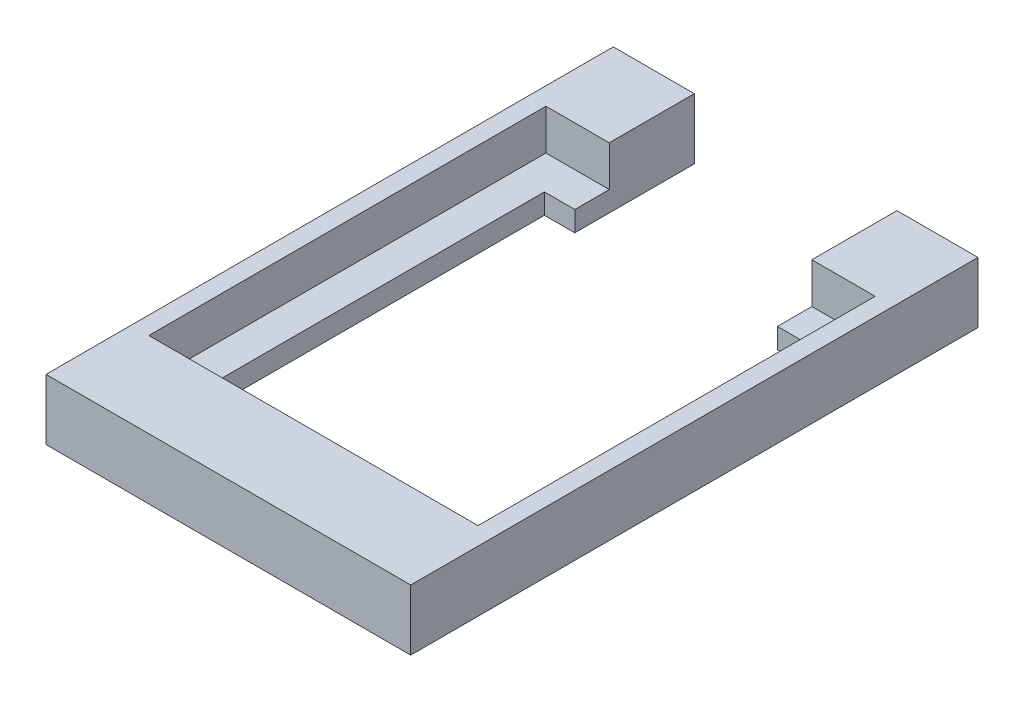
ISO-10303-21;
HEADER;
FILE_DESCRIPTION(('STEP AP214'),'2;1');
FILE_NAME('part.step','',(''),(''),'','','');
FILE_SCHEMA(('AUTOMOTIVE_DESIGN { 1 0 10303 214 1 1 1 1 }'));
ENDSEC;
DATA;
#1=APPLICATION_CONTEXT('core data for automotive mechanical design processes');
#2=APPLICATION_PROTOCOL_DEFINITION('international standard','automotive_design',2000,#1);
#3=PRODUCT_CONTEXT('',#1,'mechanical');
#4=PRODUCT('Part','Part','',(#3));
#5=PRODUCT_RELATED_PRODUCT_CATEGORY('part','',(#4));
#6=PRODUCT_DEFINITION_FORMATION('','',#4);
#7=PRODUCT_DEFINITION_CONTEXT('part definition',#1,'design');
#8=PRODUCT_DEFINITION('design','',#6,#7);
#9=PRODUCT_DEFINITION_SHAPE('','',#8);
#10=(LENGTH_UNIT() NAMED_UNIT(*) SI_UNIT(.MILLI.,.METRE.));
#11=(NAMED_UNIT(*) PLANE_ANGLE_UNIT() SI_UNIT($,.RADIAN.));
#12=(NAMED_UNIT(*) SI_UNIT($,.STERADIAN.) SOLID_ANGLE_UNIT());
#13=UNCERTAINTY_MEASURE_WITH_UNIT(LENGTH_MEASURE(1.E-05),#10,'distance_accuracy_value','');
#14=(GEOMETRIC_REPRESENTATION_CONTEXT(3) GLOBAL_UNCERTAINTY_ASSIGNED_CONTEXT((#13)) GLOBAL_UNIT_ASSIGNED_CONTEXT((#10,
#11,#12)) REPRESENTATION_CONTEXT('',''));
#15=CARTESIAN_POINT('',(0.,0.,0.));
#16=DIRECTION('',(0.,0.,1.));
#17=DIRECTION('',(1.,0.,0.));
#18=AXIS2_PLACEMENT_3D('',#15,#16,#17);
#19=CARTESIAN_POINT('',(0.,3.,-8.1));
#20=DIRECTION('',(0.,0.,-1.));
#21=DIRECTION('',(-1.,0.,0.));
#22=AXIS2_PLACEMENT_3D('',#19,#20,#21);
#23=PLANE('',#22);
#24=DIRECTION('',(1.,0.,0.));
#25=VECTOR('',#24,1.);
#26=CARTESIAN_POINT('',(0.,0.,-8.1));
#27=LINE('',#26,#25);
#28=CARTESIAN_POINT('',(-6.5,0.,-8.1));
#29=VERTEX_POINT('',#28);
#30=CARTESIAN_POINT('',(-5.,0.,-8.1));
#31=VERTEX_POINT('',#30);
#32=EDGE_CURVE('E224',#29,#31,#27,.T.);
#33=ORIENTED_EDGE('',*,*,#32,.T.);
#34=DIRECTION('',(0.,1.,0.));
#35=VECTOR('',#34,1.);
#36=CARTESIAN_POINT('',(-5.,3.,-8.1));
#37=LINE('',#36,#35);
#38=CARTESIAN_POINT('',(-5.,1.,-8.1));
#39=VERTEX_POINT('',#38);
#40=EDGE_CURVE('E283',#31,#39,#37,.T.);
#41=ORIENTED_EDGE('',*,*,#40,.T.);
#42=DIRECTION('',(1.,0.,0.));
#43=VECTOR('',#42,1.);
#44=CARTESIAN_POINT('',(0.,1.,-8.1));
#45=LINE('',#44,#43);
#46=CARTESIAN_POINT('',(-6.5,1.,-8.1));
#47=VERTEX_POINT('',#46);
#48=EDGE_CURVE('E208',#47,#39,#45,.T.);
#49=ORIENTED_EDGE('',*,*,#48,.F.);
#50=DIRECTION('',(0.,-1.,0.));
#51=VECTOR('',#50,1.);
#52=CARTESIAN_POINT('',(-6.5,3.,-8.1));
#53=LINE('',#52,#51);
#54=EDGE_CURVE('E232',#47,#29,#53,.T.);
#55=ORIENTED_EDGE('',*,*,#54,.T.);
#56=EDGE_LOOP('',(#33,#41,#49,#55));
#57=FACE_BOUND('',#56,.T.);
#58=ADVANCED_FACE('F39',(#57),#23,.F.);
#59=CARTESIAN_POINT('',(0.,3.,-14.));
#60=DIRECTION('',(0.,0.,-1.));
#61=DIRECTION('',(-1.,0.,0.));
#62=AXIS2_PLACEMENT_3D('',#59,#60,#61);
#63=PLANE('',#62);
#64=DIRECTION('',(0.,1.,0.));
#65=VECTOR('',#64,1.);
#66=CARTESIAN_POINT('',(-5.,3.,-14.));
#67=LINE('',#66,#65);
#68=CARTESIAN_POINT('',(-5.,0.,-14.));
#69=VERTEX_POINT('',#68);
#70=CARTESIAN_POINT('',(-5.,3.,-14.));
#71=VERTEX_POINT('',#70);
#72=EDGE_CURVE('E303',#69,#71,#67,.T.);
#73=ORIENTED_EDGE('',*,*,#72,.F.);
#74=DIRECTION('',(1.,0.,0.));
#75=VECTOR('',#74,1.);
#76=CARTESIAN_POINT('',(0.,0.,-14.));
#77=LINE('',#76,#75);
#78=CARTESIAN_POINT('',(-9.,0.,-14.));
#79=VERTEX_POINT('',#78);
#80=EDGE_CURVE('E259',#79,#69,#77,.T.);
#81=ORIENTED_EDGE('',*,*,#80,.F.);
#82=DIRECTION('',(0.,-1.,0.));
#83=VECTOR('',#82,1.);
#84=CARTESIAN_POINT('',(-9.,3.,-14.));
#85=LINE('',#84,#83);
#86=CARTESIAN_POINT('',(-9.,3.,-14.));
#87=VERTEX_POINT('',#86);
#88=EDGE_CURVE('E265',#87,#79,#85,.T.);
#89=ORIENTED_EDGE('',*,*,#88,.F.);
#90=DIRECTION('',(1.,0.,0.));
#91=VECTOR('',#90,1.);
#92=CARTESIAN_POINT('',(0.,3.,-14.));
#93=LINE('',#92,#91);
#94=EDGE_CURVE('E246',#87,#71,#93,.T.);
#95=ORIENTED_EDGE('',*,*,#94,.T.);
#96=EDGE_LOOP('',(#73,#81,#89,#95));
#97=FACE_BOUND('',#96,.T.);
#98=ADVANCED_FACE('F333',(#97),#63,.T.);
#99=CARTESIAN_POINT('',(8.125,1.,-9.8));
#100=DIRECTION('',(0.,0.,-1.));
#101=DIRECTION('',(-1.,0.,0.));
#102=AXIS2_PLACEMENT_3D('',#99,#100,#101);
#103=PLANE('',#102);
#104=DIRECTION('',(-1.,0.,0.));
#105=VECTOR('',#104,1.);
#106=CARTESIAN_POINT('',(8.125,1.,-9.8));
#107=LINE('',#106,#105);
#108=CARTESIAN_POINT('',(-5.,1.,-9.8));
#109=VERTEX_POINT('',#108);
#110=CARTESIAN_POINT('',(-8.125,1.,-9.8));
#111=VERTEX_POINT('',#110);
#112=EDGE_CURVE('E311',#109,#111,#107,.T.);
#113=ORIENTED_EDGE('',*,*,#112,.F.);
#114=DIRECTION('',(0.,1.,0.));
#115=VECTOR('',#114,1.);
#116=CARTESIAN_POINT('',(-5.,1.,-9.8));
#117=LINE('',#116,#115);
#118=CARTESIAN_POINT('',(-5.,3.,-9.8));
#119=VERTEX_POINT('',#118);
#120=EDGE_CURVE('E53',#109,#119,#117,.T.);
#121=ORIENTED_EDGE('',*,*,#120,.T.);
#122=DIRECTION('',(-1.,0.,0.));
#123=VECTOR('',#122,1.);
#124=CARTESIAN_POINT('',(8.125,3.,-9.8));
#125=LINE('',#124,#123);
#126=CARTESIAN_POINT('',(-8.125,3.,-9.8));
#127=VERTEX_POINT('',#126);
#128=EDGE_CURVE('E188',#119,#127,#125,.T.);
#129=ORIENTED_EDGE('',*,*,#128,.T.);
#130=DIRECTION('',(0.,1.,0.));
#131=VECTOR('',#130,1.);
#132=CARTESIAN_POINT('',(-8.125,1.,-9.8));
#133=LINE('',#132,#131);
#134=EDGE_CURVE('E197',#111,#127,#133,.T.);
#135=ORIENTED_EDGE('',*,*,#134,.F.);
#136=EDGE_LOOP('',(#113,#121,#129,#135));
#137=FACE_BOUND('',#136,.T.);
#138=ADVANCED_FACE('F330',(#137),#103,.F.);
#139=CARTESIAN_POINT('',(0.,3.,8.1));
#140=DIRECTION('',(0.,0.,-1.));
#141=DIRECTION('',(-1.,0.,0.));
#142=AXIS2_PLACEMENT_3D('',#139,#140,#141);
#143=PLANE('',#142);
#144=DIRECTION('',(0.,-1.,0.));
#145=VECTOR('',#144,1.);
#146=CARTESIAN_POINT('',(-6.5,3.,8.1));
#147=LINE('',#146,#145);
#148=CARTESIAN_POINT('',(-6.5,1.,8.1));
#149=VERTEX_POINT('',#148);
#150=CARTESIAN_POINT('',(-6.5,0.,8.1));
#151=VERTEX_POINT('',#150);
#152=EDGE_CURVE('E230',#149,#151,#147,.T.);
#153=ORIENTED_EDGE('',*,*,#152,.F.);
#154=DIRECTION('',(1.,0.,0.));
#155=VECTOR('',#154,1.);
#156=CARTESIAN_POINT('',(0.,1.,8.1));
#157=LINE('',#156,#155);
#158=CARTESIAN_POINT('',(6.5,1.,8.1));
#159=VERTEX_POINT('',#158);
#160=EDGE_CURVE('E214',#149,#159,#157,.T.);
#161=ORIENTED_EDGE('',*,*,#160,.T.);
#162=DIRECTION('',(0.,-1.,0.));
#163=VECTOR('',#162,1.);
#164=CARTESIAN_POINT('',(6.5,3.,8.1));
#165=LINE('',#164,#163);
#166=CARTESIAN_POINT('',(6.5,0.,8.1));
#167=VERTEX_POINT('',#166);
#168=EDGE_CURVE('E237',#159,#167,#165,.T.);
#169=ORIENTED_EDGE('',*,*,#168,.T.);
#170=DIRECTION('',(1.,0.,0.));
#171=VECTOR('',#170,1.);
#172=CARTESIAN_POINT('',(0.,0.,8.1));
#173=LINE('',#172,#171);
#174=EDGE_CURVE('E217',#151,#167,#173,.T.);
#175=ORIENTED_EDGE('',*,*,#174,.F.);
#176=EDGE_LOOP('',(#153,#161,#169,#175));
#177=FACE_BOUND('',#176,.T.);
#178=ADVANCED_FACE('F332',(#177),#143,.T.);
#179=CARTESIAN_POINT('',(6.5,3.,0.));
#180=DIRECTION('',(-1.,0.,0.));
#181=DIRECTION('',(0.,0.,1.));
#182=AXIS2_PLACEMENT_3D('',#179,#180,#181);
#183=PLANE('',#182);
#184=ORIENTED_EDGE('',*,*,#168,.F.);
#185=DIRECTION('',(0.,0.,-1.));
#186=VECTOR('',#185,1.);
#187=CARTESIAN_POINT('',(6.5,1.,0.));
#188=LINE('',#187,#186);
#189=CARTESIAN_POINT('',(6.5,1.,-8.1));
#190=VERTEX_POINT('',#189);
#191=EDGE_CURVE('E211',#159,#190,#188,.T.);
#192=ORIENTED_EDGE('',*,*,#191,.T.);
#193=DIRECTION('',(0.,-1.,0.));
#194=VECTOR('',#193,1.);
#195=CARTESIAN_POINT('',(6.5,3.,-8.1));
#196=LINE('',#195,#194);
#197=CARTESIAN_POINT('',(6.5,0.,-8.1));
#198=VERTEX_POINT('',#197);
#199=EDGE_CURVE('E234',#190,#198,#196,.T.);
#200=ORIENTED_EDGE('',*,*,#199,.T.);
#201=DIRECTION('',(0.,0.,-1.));
#202=VECTOR('',#201,1.);
#203=CARTESIAN_POINT('',(6.5,0.,0.));
#204=LINE('',#203,#202);
#205=EDGE_CURVE('E220',#167,#198,#204,.T.);
#206=ORIENTED_EDGE('',*,*,#205,.F.);
#207=EDGE_LOOP('',(#184,#192,#200,#206));
#208=FACE_BOUND('',#207,.T.);
#209=ADVANCED_FACE('F339',(#208),#183,.T.);
#210=CARTESIAN_POINT('',(5.,1.,-8.1));
#211=VERTEX_POINT('',#210);
#212=EDGE_CURVE('E200',#211,#190,#45,.T.);
#213=ORIENTED_EDGE('',*,*,#212,.F.);
#214=DIRECTION('',(0.,-1.,0.));
#215=VECTOR('',#214,1.);
#216=CARTESIAN_POINT('',(5.,3.,-8.1));
#217=LINE('',#216,#215);
#218=CARTESIAN_POINT('',(5.,0.,-8.1));
#219=VERTEX_POINT('',#218);
#220=EDGE_CURVE('E61',#211,#219,#217,.T.);
#221=ORIENTED_EDGE('',*,*,#220,.T.);
#222=EDGE_CURVE('E223',#219,#198,#27,.T.);
#223=ORIENTED_EDGE('',*,*,#222,.T.);
#224=ORIENTED_EDGE('',*,*,#199,.F.);
#225=EDGE_LOOP('',(#213,#221,#223,#224));
#226=FACE_BOUND('',#225,.T.);
#227=ADVANCED_FACE('F350',(#226),#23,.F.);
#228=CARTESIAN_POINT('',(-6.5,3.,0.));
#229=DIRECTION('',(-1.,0.,0.));
#230=DIRECTION('',(0.,0.,1.));
#231=AXIS2_PLACEMENT_3D('',#228,#229,#230);
#232=PLANE('',#231);
#233=DIRECTION('',(0.,0.,-1.));
#234=VECTOR('',#233,1.);
#235=CARTESIAN_POINT('',(-6.5,1.,0.));
#236=LINE('',#235,#234);
#237=EDGE_CURVE('E273',#149,#47,#236,.T.);
#238=ORIENTED_EDGE('',*,*,#237,.F.);
#239=ORIENTED_EDGE('',*,*,#152,.T.);
#240=DIRECTION('',(0.,0.,-1.));
#241=VECTOR('',#240,1.);
#242=CARTESIAN_POINT('',(-6.5,0.,0.));
#243=LINE('',#242,#241);
#244=EDGE_CURVE('E227',#151,#29,#243,.T.);
#245=ORIENTED_EDGE('',*,*,#244,.T.);
#246=ORIENTED_EDGE('',*,*,#54,.F.);
#247=EDGE_LOOP('',(#238,#239,#245,#246));
#248=FACE_BOUND('',#247,.T.);
#249=ADVANCED_FACE('F284',(#248),#232,.F.);
#250=CARTESIAN_POINT('',(0.,3.,0.));
#251=DIRECTION('',(0.,1.,0.));
#252=DIRECTION('',(0.,0.,1.));
#253=AXIS2_PLACEMENT_3D('',#250,#251,#252);
#254=PLANE('',#253);
#255=DIRECTION('',(0.,0.,1.));
#256=VECTOR('',#255,1.);
#257=CARTESIAN_POINT('',(-5.,3.,-5.30000000000001));
#258=LINE('',#257,#256);
#259=EDGE_CURVE('E182',#71,#119,#258,.T.);
#260=ORIENTED_EDGE('',*,*,#259,.F.);
#261=ORIENTED_EDGE('',*,*,#94,.F.);
#262=DIRECTION('',(0.,0.,-1.));
#263=VECTOR('',#262,1.);
#264=CARTESIAN_POINT('',(-9.,3.,0.));
#265=LINE('',#264,#263);
#266=CARTESIAN_POINT('',(-9.,3.,14.));
#267=VERTEX_POINT('',#266);
#268=EDGE_CURVE('E249',#267,#87,#265,.T.);
#269=ORIENTED_EDGE('',*,*,#268,.F.);
#270=DIRECTION('',(1.,0.,0.));
#271=VECTOR('',#270,1.);
#272=CARTESIAN_POINT('',(0.,3.,14.));
#273=LINE('',#272,#271);
#274=CARTESIAN_POINT('',(9.,3.,14.));
#275=VERTEX_POINT('',#274);
#276=EDGE_CURVE('E240',#267,#275,#273,.T.);
#277=ORIENTED_EDGE('',*,*,#276,.T.);
#278=DIRECTION('',(0.,0.,-1.));
#279=VECTOR('',#278,1.);
#280=CARTESIAN_POINT('',(9.,3.,0.));
#281=LINE('',#280,#279);
#282=CARTESIAN_POINT('',(9.,3.,-14.));
#283=VERTEX_POINT('',#282);
#284=EDGE_CURVE('E243',#275,#283,#281,.T.);
#285=ORIENTED_EDGE('',*,*,#284,.T.);
#286=CARTESIAN_POINT('',(5.,3.,-14.));
#287=VERTEX_POINT('',#286);
#288=EDGE_CURVE('E180',#287,#283,#93,.T.);
#289=ORIENTED_EDGE('',*,*,#288,.F.);
#290=DIRECTION('',(0.,0.,-1.));
#291=VECTOR('',#290,1.);
#292=CARTESIAN_POINT('',(5.,3.,-5.30000000000001));
#293=LINE('',#292,#291);
#294=CARTESIAN_POINT('',(5.,3.,-9.8));
#295=VERTEX_POINT('',#294);
#296=EDGE_CURVE('E164',#295,#287,#293,.T.);
#297=ORIENTED_EDGE('',*,*,#296,.F.);
#298=CARTESIAN_POINT('',(8.125,3.,-9.8));
#299=VERTEX_POINT('',#298);
#300=EDGE_CURVE('E178',#299,#295,#125,.T.);
#301=ORIENTED_EDGE('',*,*,#300,.F.);
#302=DIRECTION('',(0.,0.,-1.));
#303=VECTOR('',#302,1.);
#304=CARTESIAN_POINT('',(8.125,3.,9.8));
#305=LINE('',#304,#303);
#306=CARTESIAN_POINT('',(8.125,3.,9.8));
#307=VERTEX_POINT('',#306);
#308=EDGE_CURVE('E193',#307,#299,#305,.T.);
#309=ORIENTED_EDGE('',*,*,#308,.F.);
#310=DIRECTION('',(1.,0.,0.));
#311=VECTOR('',#310,1.);
#312=CARTESIAN_POINT('',(8.125,3.,9.8));
#313=LINE('',#312,#311);
#314=CARTESIAN_POINT('',(-8.125,3.,9.8));
#315=VERTEX_POINT('',#314);
#316=EDGE_CURVE('E313',#315,#307,#313,.T.);
#317=ORIENTED_EDGE('',*,*,#316,.F.);
#318=DIRECTION('',(0.,0.,1.));
#319=VECTOR('',#318,1.);
#320=CARTESIAN_POINT('',(-8.125,3.,9.8));
#321=LINE('',#320,#319);
#322=EDGE_CURVE('E304',#127,#315,#321,.T.);
#323=ORIENTED_EDGE('',*,*,#322,.F.);
#324=ORIENTED_EDGE('',*,*,#128,.F.);
#325=EDGE_LOOP('',(#260,#261,#269,#277,#285,#289,#297,#301,#309,#317,#323,#324));
#326=FACE_BOUND('',#325,.T.);
#327=ADVANCED_FACE('F176',(#326),#254,.T.);
#328=CARTESIAN_POINT('',(0.,0.,0.));
#329=DIRECTION('',(0.,1.,0.));
#330=DIRECTION('',(0.,0.,1.));
#331=AXIS2_PLACEMENT_3D('',#328,#329,#330);
#332=PLANE('',#331);
#333=ORIENTED_EDGE('',*,*,#80,.T.);
#334=DIRECTION('',(0.,0.,1.));
#335=VECTOR('',#334,1.);
#336=CARTESIAN_POINT('',(-5.,0.,-5.30000000000001));
#337=LINE('',#336,#335);
#338=EDGE_CURVE('E181',#69,#31,#337,.T.);
#339=ORIENTED_EDGE('',*,*,#338,.T.);
#340=ORIENTED_EDGE('',*,*,#32,.F.);
#341=ORIENTED_EDGE('',*,*,#244,.F.);
#342=ORIENTED_EDGE('',*,*,#174,.T.);
#343=ORIENTED_EDGE('',*,*,#205,.T.);
#344=ORIENTED_EDGE('',*,*,#222,.F.);
#345=DIRECTION('',(0.,0.,-1.));
#346=VECTOR('',#345,1.);
#347=CARTESIAN_POINT('',(5.,0.,-5.30000000000001));
#348=LINE('',#347,#346);
#349=CARTESIAN_POINT('',(5.,0.,-14.));
#350=VERTEX_POINT('',#349);
#351=EDGE_CURVE('E170',#219,#350,#348,.T.);
#352=ORIENTED_EDGE('',*,*,#351,.T.);
#353=CARTESIAN_POINT('',(9.,0.,-14.));
#354=VERTEX_POINT('',#353);
#355=EDGE_CURVE('E258',#350,#354,#77,.T.);
#356=ORIENTED_EDGE('',*,*,#355,.T.);
#357=DIRECTION('',(0.,0.,-1.));
#358=VECTOR('',#357,1.);
#359=CARTESIAN_POINT('',(9.,0.,0.));
#360=LINE('',#359,#358);
#361=CARTESIAN_POINT('',(9.,0.,14.));
#362=VERTEX_POINT('',#361);
#363=EDGE_CURVE('E255',#362,#354,#360,.T.);
#364=ORIENTED_EDGE('',*,*,#363,.F.);
#365=DIRECTION('',(1.,0.,0.));
#366=VECTOR('',#365,1.);
#367=CARTESIAN_POINT('',(0.,0.,14.));
#368=LINE('',#367,#366);
#369=CARTESIAN_POINT('',(-9.,0.,14.));
#370=VERTEX_POINT('',#369);
#371=EDGE_CURVE('E239',#370,#362,#368,.T.);
#372=ORIENTED_EDGE('',*,*,#371,.F.);
#373=DIRECTION('',(0.,0.,-1.));
#374=VECTOR('',#373,1.);
#375=CARTESIAN_POINT('',(-9.,0.,0.));
#376=LINE('',#375,#374);
#377=EDGE_CURVE('E244',#370,#79,#376,.T.);
#378=ORIENTED_EDGE('',*,*,#377,.T.);
#379=EDGE_LOOP('',(#333,#339,#340,#341,#342,#343,#344,#352,#356,#364,#372,#378));
#380=FACE_BOUND('',#379,.T.);
#381=ADVANCED_FACE('F290',(#380),#332,.F.);
#382=CARTESIAN_POINT('',(0.,3.,14.));
#383=DIRECTION('',(0.,0.,-1.));
#384=DIRECTION('',(-1.,0.,0.));
#385=AXIS2_PLACEMENT_3D('',#382,#383,#384);
#386=PLANE('',#385);
#387=ORIENTED_EDGE('',*,*,#371,.T.);
#388=DIRECTION('',(0.,-1.,0.));
#389=VECTOR('',#388,1.);
#390=CARTESIAN_POINT('',(9.,3.,14.));
#391=LINE('',#390,#389);
#392=EDGE_CURVE('E270',#275,#362,#391,.T.);
#393=ORIENTED_EDGE('',*,*,#392,.F.);
#394=ORIENTED_EDGE('',*,*,#276,.F.);
#395=DIRECTION('',(0.,-1.,0.));
#396=VECTOR('',#395,1.);
#397=CARTESIAN_POINT('',(-9.,3.,14.));
#398=LINE('',#397,#396);
#399=EDGE_CURVE('E252',#267,#370,#398,.T.);
#400=ORIENTED_EDGE('',*,*,#399,.T.);
#401=EDGE_LOOP('',(#387,#393,#394,#400));
#402=FACE_BOUND('',#401,.T.);
#403=ADVANCED_FACE('F41',(#402),#386,.F.);
#404=CARTESIAN_POINT('',(9.,3.,0.));
#405=DIRECTION('',(-1.,0.,0.));
#406=DIRECTION('',(0.,0.,1.));
#407=AXIS2_PLACEMENT_3D('',#404,#405,#406);
#408=PLANE('',#407);
#409=ORIENTED_EDGE('',*,*,#363,.T.);
#410=DIRECTION('',(0.,-1.,0.));
#411=VECTOR('',#410,1.);
#412=CARTESIAN_POINT('',(9.,3.,-14.));
#413=LINE('',#412,#411);
#414=EDGE_CURVE('E267',#283,#354,#413,.T.);
#415=ORIENTED_EDGE('',*,*,#414,.F.);
#416=ORIENTED_EDGE('',*,*,#284,.F.);
#417=ORIENTED_EDGE('',*,*,#392,.T.);
#418=EDGE_LOOP('',(#409,#415,#416,#417));
#419=FACE_BOUND('',#418,.T.);
#420=ADVANCED_FACE('F371',(#419),#408,.F.);
#421=DIRECTION('',(0.,-1.,0.));
#422=VECTOR('',#421,1.);
#423=CARTESIAN_POINT('',(5.,3.,-14.));
#424=LINE('',#423,#422);
#425=EDGE_CURVE('E299',#287,#350,#424,.T.);
#426=ORIENTED_EDGE('',*,*,#425,.F.);
#427=ORIENTED_EDGE('',*,*,#288,.T.);
#428=ORIENTED_EDGE('',*,*,#414,.T.);
#429=ORIENTED_EDGE('',*,*,#355,.F.);
#430=EDGE_LOOP('',(#426,#427,#428,#429));
#431=FACE_BOUND('',#430,.T.);
#432=ADVANCED_FACE('F344',(#431),#63,.T.);
#433=CARTESIAN_POINT('',(-9.,3.,0.));
#434=DIRECTION('',(-1.,0.,0.));
#435=DIRECTION('',(0.,0.,1.));
#436=AXIS2_PLACEMENT_3D('',#433,#434,#435);
#437=PLANE('',#436);
#438=ORIENTED_EDGE('',*,*,#377,.F.);
#439=ORIENTED_EDGE('',*,*,#399,.F.);
#440=ORIENTED_EDGE('',*,*,#268,.T.);
#441=ORIENTED_EDGE('',*,*,#88,.T.);
#442=EDGE_LOOP('',(#438,#439,#440,#441));
#443=FACE_BOUND('',#442,.T.);
#444=ADVANCED_FACE('F377',(#443),#437,.T.);
#445=CARTESIAN_POINT('',(-8.125,1.,9.8));
#446=DIRECTION('',(-1.,0.,0.));
#447=DIRECTION('',(0.,0.,1.));
#448=AXIS2_PLACEMENT_3D('',#445,#446,#447);
#449=PLANE('',#448);
#450=ORIENTED_EDGE('',*,*,#322,.T.);
#451=DIRECTION('',(0.,1.,0.));
#452=VECTOR('',#451,1.);
#453=CARTESIAN_POINT('',(-8.125,1.,9.8));
#454=LINE('',#453,#452);
#455=CARTESIAN_POINT('',(-8.125,1.,9.8));
#456=VERTEX_POINT('',#455);
#457=EDGE_CURVE('E204',#456,#315,#454,.T.);
#458=ORIENTED_EDGE('',*,*,#457,.F.);
#459=DIRECTION('',(0.,0.,1.));
#460=VECTOR('',#459,1.);
#461=CARTESIAN_POINT('',(-8.125,1.,9.8));
#462=LINE('',#461,#460);
#463=EDGE_CURVE('E187',#111,#456,#462,.T.);
#464=ORIENTED_EDGE('',*,*,#463,.F.);
#465=ORIENTED_EDGE('',*,*,#134,.T.);
#466=EDGE_LOOP('',(#450,#458,#464,#465));
#467=FACE_BOUND('',#466,.T.);
#468=ADVANCED_FACE('F323',(#467),#449,.F.);
#469=ORIENTED_EDGE('',*,*,#300,.T.);
#470=DIRECTION('',(0.,-1.,0.));
#471=VECTOR('',#470,1.);
#472=CARTESIAN_POINT('',(5.,1.,-9.8));
#473=LINE('',#472,#471);
#474=CARTESIAN_POINT('',(5.,1.,-9.8));
#475=VERTEX_POINT('',#474);
#476=EDGE_CURVE('E161',#295,#475,#473,.T.);
#477=ORIENTED_EDGE('',*,*,#476,.T.);
#478=CARTESIAN_POINT('',(8.125,1.,-9.8));
#479=VERTEX_POINT('',#478);
#480=EDGE_CURVE('E207',#479,#475,#107,.T.);
#481=ORIENTED_EDGE('',*,*,#480,.F.);
#482=DIRECTION('',(0.,1.,0.));
#483=VECTOR('',#482,1.);
#484=CARTESIAN_POINT('',(8.125,1.,-9.8));
#485=LINE('',#484,#483);
#486=EDGE_CURVE('E185',#479,#299,#485,.T.);
#487=ORIENTED_EDGE('',*,*,#486,.T.);
#488=EDGE_LOOP('',(#469,#477,#481,#487));
#489=FACE_BOUND('',#488,.T.);
#490=ADVANCED_FACE('F184',(#489),#103,.F.);
#491=CARTESIAN_POINT('',(8.125,1.,9.8));
#492=DIRECTION('',(1.,0.,0.));
#493=DIRECTION('',(0.,0.,-1.));
#494=AXIS2_PLACEMENT_3D('',#491,#492,#493);
#495=PLANE('',#494);
#496=ORIENTED_EDGE('',*,*,#308,.T.);
#497=ORIENTED_EDGE('',*,*,#486,.F.);
#498=DIRECTION('',(0.,0.,-1.));
#499=VECTOR('',#498,1.);
#500=CARTESIAN_POINT('',(8.125,1.,9.8));
#501=LINE('',#500,#499);
#502=CARTESIAN_POINT('',(8.125,1.,9.8));
#503=VERTEX_POINT('',#502);
#504=EDGE_CURVE('E308',#503,#479,#501,.T.);
#505=ORIENTED_EDGE('',*,*,#504,.F.);
#506=DIRECTION('',(0.,1.,0.));
#507=VECTOR('',#506,1.);
#508=CARTESIAN_POINT('',(8.125,1.,9.8));
#509=LINE('',#508,#507);
#510=EDGE_CURVE('E202',#503,#307,#509,.T.);
#511=ORIENTED_EDGE('',*,*,#510,.T.);
#512=EDGE_LOOP('',(#496,#497,#505,#511));
#513=FACE_BOUND('',#512,.T.);
#514=ADVANCED_FACE('F318',(#513),#495,.F.);
#515=CARTESIAN_POINT('',(8.125,1.,9.8));
#516=DIRECTION('',(0.,0.,1.));
#517=DIRECTION('',(1.,0.,0.));
#518=AXIS2_PLACEMENT_3D('',#515,#516,#517);
#519=PLANE('',#518);
#520=ORIENTED_EDGE('',*,*,#316,.T.);
#521=ORIENTED_EDGE('',*,*,#510,.F.);
#522=DIRECTION('',(1.,0.,0.));
#523=VECTOR('',#522,1.);
#524=CARTESIAN_POINT('',(8.125,1.,9.8));
#525=LINE('',#524,#523);
#526=EDGE_CURVE('E191',#456,#503,#525,.T.);
#527=ORIENTED_EDGE('',*,*,#526,.F.);
#528=ORIENTED_EDGE('',*,*,#457,.T.);
#529=EDGE_LOOP('',(#520,#521,#527,#528));
#530=FACE_BOUND('',#529,.T.);
#531=ADVANCED_FACE('F327',(#530),#519,.F.);
#532=CARTESIAN_POINT('',(0.,1.,0.));
#533=DIRECTION('',(0.,1.,0.));
#534=DIRECTION('',(0.,0.,1.));
#535=AXIS2_PLACEMENT_3D('',#532,#533,#534);
#536=PLANE('',#535);
#537=DIRECTION('',(0.,0.,1.));
#538=VECTOR('',#537,1.);
#539=CARTESIAN_POINT('',(-5.,1.,0.));
#540=LINE('',#539,#538);
#541=EDGE_CURVE('E11',#109,#39,#540,.T.);
#542=ORIENTED_EDGE('',*,*,#541,.F.);
#543=ORIENTED_EDGE('',*,*,#112,.T.);
#544=ORIENTED_EDGE('',*,*,#463,.T.);
#545=ORIENTED_EDGE('',*,*,#526,.T.);
#546=ORIENTED_EDGE('',*,*,#504,.T.);
#547=ORIENTED_EDGE('',*,*,#480,.T.);
#548=DIRECTION('',(0.,0.,-1.));
#549=VECTOR('',#548,1.);
#550=CARTESIAN_POINT('',(5.,1.,0.));
#551=LINE('',#550,#549);
#552=EDGE_CURVE('E47',#211,#475,#551,.T.);
#553=ORIENTED_EDGE('',*,*,#552,.F.);
#554=ORIENTED_EDGE('',*,*,#212,.T.);
#555=ORIENTED_EDGE('',*,*,#191,.F.);
#556=ORIENTED_EDGE('',*,*,#160,.F.);
#557=ORIENTED_EDGE('',*,*,#237,.T.);
#558=ORIENTED_EDGE('',*,*,#48,.T.);
#559=EDGE_LOOP('',(#542,#543,#544,#545,#546,#547,#553,#554,#555,#556,#557,#558));
#560=FACE_BOUND('',#559,.T.);
#561=ADVANCED_FACE('F277',(#560),#536,.T.);
#562=CARTESIAN_POINT('',(5.,0.,-5.30000000000001));
#563=DIRECTION('',(1.,0.,0.));
#564=DIRECTION('',(0.,0.,-1.));
#565=AXIS2_PLACEMENT_3D('',#562,#563,#564);
#566=PLANE('',#565);
#567=ORIENTED_EDGE('',*,*,#425,.T.);
#568=ORIENTED_EDGE('',*,*,#351,.F.);
#569=ORIENTED_EDGE('',*,*,#220,.F.);
#570=ORIENTED_EDGE('',*,*,#552,.T.);
#571=ORIENTED_EDGE('',*,*,#476,.F.);
#572=ORIENTED_EDGE('',*,*,#296,.T.);
#573=EDGE_LOOP('',(#567,#568,#569,#570,#571,#572));
#574=FACE_BOUND('',#573,.T.);
#575=ADVANCED_FACE('F163',(#574),#566,.F.);
#576=CARTESIAN_POINT('',(-5.,0.,-5.30000000000001));
#577=DIRECTION('',(-1.,0.,0.));
#578=DIRECTION('',(0.,0.,1.));
#579=AXIS2_PLACEMENT_3D('',#576,#577,#578);
#580=PLANE('',#579);
#581=ORIENTED_EDGE('',*,*,#72,.T.);
#582=ORIENTED_EDGE('',*,*,#259,.T.);
#583=ORIENTED_EDGE('',*,*,#120,.F.);
#584=ORIENTED_EDGE('',*,*,#541,.T.);
#585=ORIENTED_EDGE('',*,*,#40,.F.);
#586=ORIENTED_EDGE('',*,*,#338,.F.);
#587=EDGE_LOOP('',(#581,#582,#583,#584,#585,#586));
#588=FACE_BOUND('',#587,.T.);
#589=ADVANCED_FACE('F381',(#588),#580,.F.);
#590=CLOSED_SHELL('',(#58,#98,#138,#178,#209,#227,#249,#327,#381,#403,#420,#432,#444,#468,#490,
#514,#531,#561,#575,#589));
#591=MANIFOLD_SOLID_BREP('B2',#590);
#592=ADVANCED_BREP_SHAPE_REPRESENTATION('',(#18,#591),#14);
#593=SHAPE_DEFINITION_REPRESENTATION(#9,#592);
ENDSEC;
END-ISO-10303-21;
